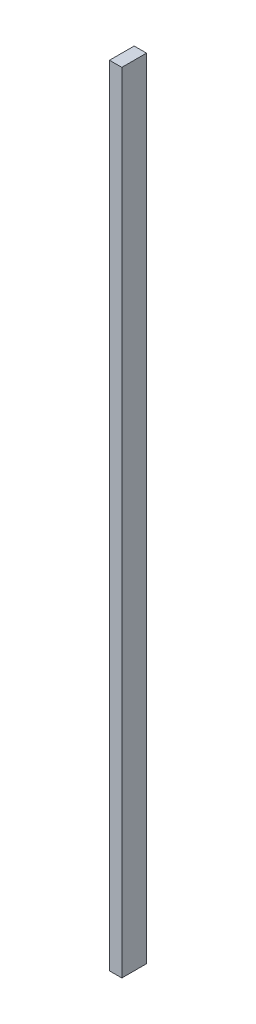
ISO-10303-21;
HEADER;
FILE_DESCRIPTION(('STEP AP214'),'2;1');
FILE_NAME('part.step','',(''),(''),'','','');
FILE_SCHEMA(('AUTOMOTIVE_DESIGN { 1 0 10303 214 1 1 1 1 }'));
ENDSEC;
DATA;
#1=APPLICATION_CONTEXT('core data for automotive mechanical design processes');
#2=APPLICATION_PROTOCOL_DEFINITION('international standard','automotive_design',2000,#1);
#3=PRODUCT_CONTEXT('',#1,'mechanical');
#4=PRODUCT('Part','Part','',(#3));
#5=PRODUCT_RELATED_PRODUCT_CATEGORY('part','',(#4));
#6=PRODUCT_DEFINITION_FORMATION('','',#4);
#7=PRODUCT_DEFINITION_CONTEXT('part definition',#1,'design');
#8=PRODUCT_DEFINITION('design','',#6,#7);
#9=PRODUCT_DEFINITION_SHAPE('','',#8);
#10=(LENGTH_UNIT() NAMED_UNIT(*) SI_UNIT(.MILLI.,.METRE.));
#11=(NAMED_UNIT(*) PLANE_ANGLE_UNIT() SI_UNIT($,.RADIAN.));
#12=(NAMED_UNIT(*) SI_UNIT($,.STERADIAN.) SOLID_ANGLE_UNIT());
#13=UNCERTAINTY_MEASURE_WITH_UNIT(LENGTH_MEASURE(1.E-05),#10,'distance_accuracy_value','');
#14=(GEOMETRIC_REPRESENTATION_CONTEXT(3) GLOBAL_UNCERTAINTY_ASSIGNED_CONTEXT((#13)) GLOBAL_UNIT_ASSIGNED_CONTEXT((#10,
#11,#12)) REPRESENTATION_CONTEXT('',''));
#15=CARTESIAN_POINT('',(0.,0.,0.));
#16=DIRECTION('',(0.,0.,1.));
#17=DIRECTION('',(1.,0.,0.));
#18=AXIS2_PLACEMENT_3D('',#15,#16,#17);
#19=CARTESIAN_POINT('',(-12.5,1600.,-25.));
#20=DIRECTION('',(1.,0.,0.));
#21=DIRECTION('',(0.,0.,-1.));
#22=AXIS2_PLACEMENT_3D('',#19,#20,#21);
#23=PLANE('',#22);
#24=DIRECTION('',(0.,0.,1.));
#25=VECTOR('',#24,1.);
#26=CARTESIAN_POINT('',(-12.5,0.,-25.));
#27=LINE('',#26,#25);
#28=CARTESIAN_POINT('',(-12.5,0.,-25.));
#29=VERTEX_POINT('',#28);
#30=CARTESIAN_POINT('',(-12.5,0.,25.));
#31=VERTEX_POINT('',#30);
#32=EDGE_CURVE('E111',#29,#31,#27,.T.);
#33=ORIENTED_EDGE('',*,*,#32,.T.);
#34=DIRECTION('',(0.,-1.,0.));
#35=VECTOR('',#34,1.);
#36=CARTESIAN_POINT('',(-12.5,1600.,25.));
#37=LINE('',#36,#35);
#38=CARTESIAN_POINT('',(-12.5,1600.,25.));
#39=VERTEX_POINT('',#38);
#40=EDGE_CURVE('E11',#39,#31,#37,.T.);
#41=ORIENTED_EDGE('',*,*,#40,.F.);
#42=DIRECTION('',(0.,0.,1.));
#43=VECTOR('',#42,1.);
#44=CARTESIAN_POINT('',(-12.5,1600.,-25.));
#45=LINE('',#44,#43);
#46=CARTESIAN_POINT('',(-12.5,1600.,-25.));
#47=VERTEX_POINT('',#46);
#48=EDGE_CURVE('E95',#47,#39,#45,.T.);
#49=ORIENTED_EDGE('',*,*,#48,.F.);
#50=DIRECTION('',(0.,-1.,0.));
#51=VECTOR('',#50,1.);
#52=CARTESIAN_POINT('',(-12.5,1600.,-25.));
#53=LINE('',#52,#51);
#54=EDGE_CURVE('E107',#47,#29,#53,.T.);
#55=ORIENTED_EDGE('',*,*,#54,.T.);
#56=EDGE_LOOP('',(#33,#41,#49,#55));
#57=FACE_BOUND('',#56,.T.);
#58=ADVANCED_FACE('F43',(#57),#23,.F.);
#59=CARTESIAN_POINT('',(12.5,1600.,25.));
#60=DIRECTION('',(0.,0.,-1.));
#61=DIRECTION('',(-1.,0.,0.));
#62=AXIS2_PLACEMENT_3D('',#59,#60,#61);
#63=PLANE('',#62);
#64=DIRECTION('',(1.,0.,0.));
#65=VECTOR('',#64,1.);
#66=CARTESIAN_POINT('',(12.5,0.,25.));
#67=LINE('',#66,#65);
#68=CARTESIAN_POINT('',(12.5,0.,25.));
#69=VERTEX_POINT('',#68);
#70=EDGE_CURVE('E100',#31,#69,#67,.T.);
#71=ORIENTED_EDGE('',*,*,#70,.T.);
#72=DIRECTION('',(0.,-1.,0.));
#73=VECTOR('',#72,1.);
#74=CARTESIAN_POINT('',(12.5,1600.,25.));
#75=LINE('',#74,#73);
#76=CARTESIAN_POINT('',(12.5,1600.,25.));
#77=VERTEX_POINT('',#76);
#78=EDGE_CURVE('E52',#77,#69,#75,.T.);
#79=ORIENTED_EDGE('',*,*,#78,.F.);
#80=DIRECTION('',(1.,0.,0.));
#81=VECTOR('',#80,1.);
#82=CARTESIAN_POINT('',(12.5,1600.,25.));
#83=LINE('',#82,#81);
#84=EDGE_CURVE('E90',#39,#77,#83,.T.);
#85=ORIENTED_EDGE('',*,*,#84,.F.);
#86=ORIENTED_EDGE('',*,*,#40,.T.);
#87=EDGE_LOOP('',(#71,#79,#85,#86));
#88=FACE_BOUND('',#87,.T.);
#89=ADVANCED_FACE('F99',(#88),#63,.F.);
#90=CARTESIAN_POINT('',(12.5,1600.,-25.));
#91=DIRECTION('',(-1.,0.,0.));
#92=DIRECTION('',(0.,0.,1.));
#93=AXIS2_PLACEMENT_3D('',#90,#91,#92);
#94=PLANE('',#93);
#95=DIRECTION('',(0.,0.,-1.));
#96=VECTOR('',#95,1.);
#97=CARTESIAN_POINT('',(12.5,0.,-25.));
#98=LINE('',#97,#96);
#99=CARTESIAN_POINT('',(12.5,0.,-25.));
#100=VERTEX_POINT('',#99);
#101=EDGE_CURVE('E77',#69,#100,#98,.T.);
#102=ORIENTED_EDGE('',*,*,#101,.T.);
#103=DIRECTION('',(0.,-1.,0.));
#104=VECTOR('',#103,1.);
#105=CARTESIAN_POINT('',(12.5,1600.,-25.));
#106=LINE('',#105,#104);
#107=CARTESIAN_POINT('',(12.5,1600.,-25.));
#108=VERTEX_POINT('',#107);
#109=EDGE_CURVE('E102',#108,#100,#106,.T.);
#110=ORIENTED_EDGE('',*,*,#109,.F.);
#111=DIRECTION('',(0.,0.,-1.));
#112=VECTOR('',#111,1.);
#113=CARTESIAN_POINT('',(12.5,1600.,-25.));
#114=LINE('',#113,#112);
#115=EDGE_CURVE('E93',#77,#108,#114,.T.);
#116=ORIENTED_EDGE('',*,*,#115,.F.);
#117=ORIENTED_EDGE('',*,*,#78,.T.);
#118=EDGE_LOOP('',(#102,#110,#116,#117));
#119=FACE_BOUND('',#118,.T.);
#120=ADVANCED_FACE('F103',(#119),#94,.F.);
#121=CARTESIAN_POINT('',(12.5,1600.,-25.));
#122=DIRECTION('',(0.,0.,1.));
#123=DIRECTION('',(1.,0.,0.));
#124=AXIS2_PLACEMENT_3D('',#121,#122,#123);
#125=PLANE('',#124);
#126=DIRECTION('',(-1.,0.,0.));
#127=VECTOR('',#126,1.);
#128=CARTESIAN_POINT('',(12.5,0.,-25.));
#129=LINE('',#128,#127);
#130=EDGE_CURVE('E83',#100,#29,#129,.T.);
#131=ORIENTED_EDGE('',*,*,#130,.T.);
#132=ORIENTED_EDGE('',*,*,#54,.F.);
#133=DIRECTION('',(-1.,0.,0.));
#134=VECTOR('',#133,1.);
#135=CARTESIAN_POINT('',(12.5,1600.,-25.));
#136=LINE('',#135,#134);
#137=EDGE_CURVE('E60',#108,#47,#136,.T.);
#138=ORIENTED_EDGE('',*,*,#137,.F.);
#139=ORIENTED_EDGE('',*,*,#109,.T.);
#140=EDGE_LOOP('',(#131,#132,#138,#139));
#141=FACE_BOUND('',#140,.T.);
#142=ADVANCED_FACE('F124',(#141),#125,.F.);
#143=CARTESIAN_POINT('',(0.,1600.,0.));
#144=DIRECTION('',(0.,-1.,0.));
#145=DIRECTION('',(0.,0.,-1.));
#146=AXIS2_PLACEMENT_3D('',#143,#144,#145);
#147=PLANE('',#146);
#148=ORIENTED_EDGE('',*,*,#48,.T.);
#149=ORIENTED_EDGE('',*,*,#84,.T.);
#150=ORIENTED_EDGE('',*,*,#115,.T.);
#151=ORIENTED_EDGE('',*,*,#137,.T.);
#152=EDGE_LOOP('',(#148,#149,#150,#151));
#153=FACE_BOUND('',#152,.T.);
#154=ADVANCED_FACE('F91',(#153),#147,.F.);
#155=CARTESIAN_POINT('',(0.,0.,0.));
#156=DIRECTION('',(0.,-1.,0.));
#157=DIRECTION('',(0.,0.,-1.));
#158=AXIS2_PLACEMENT_3D('',#155,#156,#157);
#159=PLANE('',#158);
#160=ORIENTED_EDGE('',*,*,#32,.F.);
#161=ORIENTED_EDGE('',*,*,#130,.F.);
#162=ORIENTED_EDGE('',*,*,#101,.F.);
#163=ORIENTED_EDGE('',*,*,#70,.F.);
#164=EDGE_LOOP('',(#160,#161,#162,#163));
#165=FACE_BOUND('',#164,.T.);
#166=ADVANCED_FACE('F127',(#165),#159,.T.);
#167=CLOSED_SHELL('',(#58,#89,#120,#142,#154,#166));
#168=MANIFOLD_SOLID_BREP('B2',#167);
#169=ADVANCED_BREP_SHAPE_REPRESENTATION('',(#18,#168),#14);
#170=SHAPE_DEFINITION_REPRESENTATION(#9,#169);
ENDSEC;
END-ISO-10303-21;
